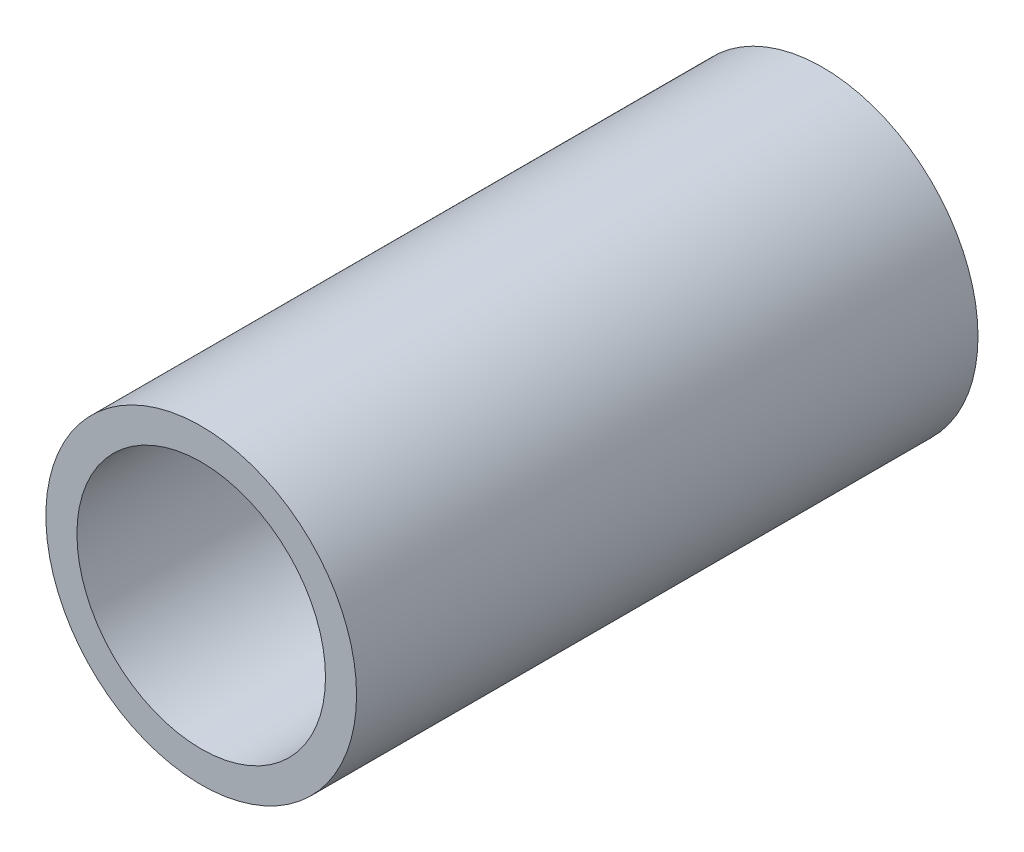
ISO-10303-21;
HEADER;
FILE_DESCRIPTION(('STEP AP214'),'2;1');
FILE_NAME('part.step','',(''),(''),'','','');
FILE_SCHEMA(('AUTOMOTIVE_DESIGN { 1 0 10303 214 1 1 1 1 }'));
ENDSEC;
DATA;
#1=APPLICATION_CONTEXT('core data for automotive mechanical design processes');
#2=APPLICATION_PROTOCOL_DEFINITION('international standard','automotive_design',2000,#1);
#3=PRODUCT_CONTEXT('',#1,'mechanical');
#4=PRODUCT('Part','Part','',(#3));
#5=PRODUCT_RELATED_PRODUCT_CATEGORY('part','',(#4));
#6=PRODUCT_DEFINITION_FORMATION('','',#4);
#7=PRODUCT_DEFINITION_CONTEXT('part definition',#1,'design');
#8=PRODUCT_DEFINITION('design','',#6,#7);
#9=PRODUCT_DEFINITION_SHAPE('','',#8);
#10=(LENGTH_UNIT() NAMED_UNIT(*) SI_UNIT(.MILLI.,.METRE.));
#11=(NAMED_UNIT(*) PLANE_ANGLE_UNIT() SI_UNIT($,.RADIAN.));
#12=(NAMED_UNIT(*) SI_UNIT($,.STERADIAN.) SOLID_ANGLE_UNIT());
#13=UNCERTAINTY_MEASURE_WITH_UNIT(LENGTH_MEASURE(1.E-05),#10,'distance_accuracy_value','');
#14=(GEOMETRIC_REPRESENTATION_CONTEXT(3) GLOBAL_UNCERTAINTY_ASSIGNED_CONTEXT((#13)) GLOBAL_UNIT_ASSIGNED_CONTEXT((#10,
#11,#12)) REPRESENTATION_CONTEXT('',''));
#15=CARTESIAN_POINT('',(0.,0.,0.));
#16=DIRECTION('',(0.,0.,1.));
#17=DIRECTION('',(1.,0.,0.));
#18=AXIS2_PLACEMENT_3D('',#15,#16,#17);
#19=CARTESIAN_POINT('',(0.,0.,40.));
#20=DIRECTION('',(0.,0.,1.));
#21=DIRECTION('',(1.,0.,0.));
#22=AXIS2_PLACEMENT_3D('',#19,#20,#21);
#23=PLANE('',#22);
#24=CARTESIAN_POINT('',(0.,0.,40.));
#25=DIRECTION('',(0.,0.,1.));
#26=DIRECTION('',(1.,0.,0.));
#27=AXIS2_PLACEMENT_3D('',#24,#25,#26);
#28=CIRCLE('',#27,10.);
#29=CARTESIAN_POINT('',(10.,0.,40.));
#30=VERTEX_POINT('',#29);
#31=EDGE_CURVE('E10',#30,#30,#28,.T.);
#32=ORIENTED_EDGE('',*,*,#31,.T.);
#33=EDGE_LOOP('',(#32));
#34=FACE_BOUND('',#33,.T.);
#35=CARTESIAN_POINT('',(0.,0.,40.));
#36=DIRECTION('',(0.,0.,1.));
#37=DIRECTION('',(1.,0.,0.));
#38=AXIS2_PLACEMENT_3D('',#35,#36,#37);
#39=CIRCLE('',#38,8.);
#40=CARTESIAN_POINT('',(8.,0.,40.));
#41=VERTEX_POINT('',#40);
#42=EDGE_CURVE('E56',#41,#41,#39,.T.);
#43=ORIENTED_EDGE('',*,*,#42,.F.);
#44=EDGE_LOOP('',(#43));
#45=FACE_BOUND('',#44,.T.);
#46=ADVANCED_FACE('F43',(#34,#45),#23,.T.);
#47=CARTESIAN_POINT('',(0.,0.,0.));
#48=DIRECTION('',(0.,0.,1.));
#49=DIRECTION('',(1.,0.,0.));
#50=AXIS2_PLACEMENT_3D('',#47,#48,#49);
#51=PLANE('',#50);
#52=CARTESIAN_POINT('',(0.,0.,0.));
#53=DIRECTION('',(0.,0.,1.));
#54=DIRECTION('',(1.,0.,0.));
#55=AXIS2_PLACEMENT_3D('',#52,#53,#54);
#56=CIRCLE('',#55,10.);
#57=CARTESIAN_POINT('',(10.,0.,0.));
#58=VERTEX_POINT('',#57);
#59=EDGE_CURVE('E47',#58,#58,#56,.T.);
#60=ORIENTED_EDGE('',*,*,#59,.F.);
#61=EDGE_LOOP('',(#60));
#62=FACE_BOUND('',#61,.T.);
#63=CARTESIAN_POINT('',(0.,0.,0.));
#64=DIRECTION('',(0.,0.,1.));
#65=DIRECTION('',(1.,0.,0.));
#66=AXIS2_PLACEMENT_3D('',#63,#64,#65);
#67=CIRCLE('',#66,8.);
#68=CARTESIAN_POINT('',(8.,0.,0.));
#69=VERTEX_POINT('',#68);
#70=EDGE_CURVE('E58',#69,#69,#67,.T.);
#71=ORIENTED_EDGE('',*,*,#70,.T.);
#72=EDGE_LOOP('',(#71));
#73=FACE_BOUND('',#72,.T.);
#74=ADVANCED_FACE('F70',(#62,#73),#51,.F.);
#75=CARTESIAN_POINT('',(0.,0.,40.));
#76=DIRECTION('',(0.,0.,-1.));
#77=DIRECTION('',(-1.,0.,0.));
#78=AXIS2_PLACEMENT_3D('',#75,#76,#77);
#79=CYLINDRICAL_SURFACE('',#78,10.);
#80=ORIENTED_EDGE('',*,*,#31,.F.);
#81=EDGE_LOOP('',(#80));
#82=FACE_BOUND('',#81,.T.);
#83=ORIENTED_EDGE('',*,*,#59,.T.);
#84=EDGE_LOOP('',(#83));
#85=FACE_BOUND('',#84,.T.);
#86=ADVANCED_FACE('F45',(#82,#85),#79,.T.);
#87=CARTESIAN_POINT('',(0.,0.,40.));
#88=DIRECTION('',(0.,0.,-1.));
#89=DIRECTION('',(-1.,0.,0.));
#90=AXIS2_PLACEMENT_3D('',#87,#88,#89);
#91=CYLINDRICAL_SURFACE('',#90,8.);
#92=ORIENTED_EDGE('',*,*,#42,.T.);
#93=EDGE_LOOP('',(#92));
#94=FACE_BOUND('',#93,.T.);
#95=ORIENTED_EDGE('',*,*,#70,.F.);
#96=EDGE_LOOP('',(#95));
#97=FACE_BOUND('',#96,.T.);
#98=ADVANCED_FACE('F66',(#94,#97),#91,.F.);
#99=CLOSED_SHELL('',(#46,#74,#86,#98));
#100=MANIFOLD_SOLID_BREP('B2',#99);
#101=ADVANCED_BREP_SHAPE_REPRESENTATION('',(#18,#100),#14);
#102=SHAPE_DEFINITION_REPRESENTATION(#9,#101);
ENDSEC;
END-ISO-10303-21;
